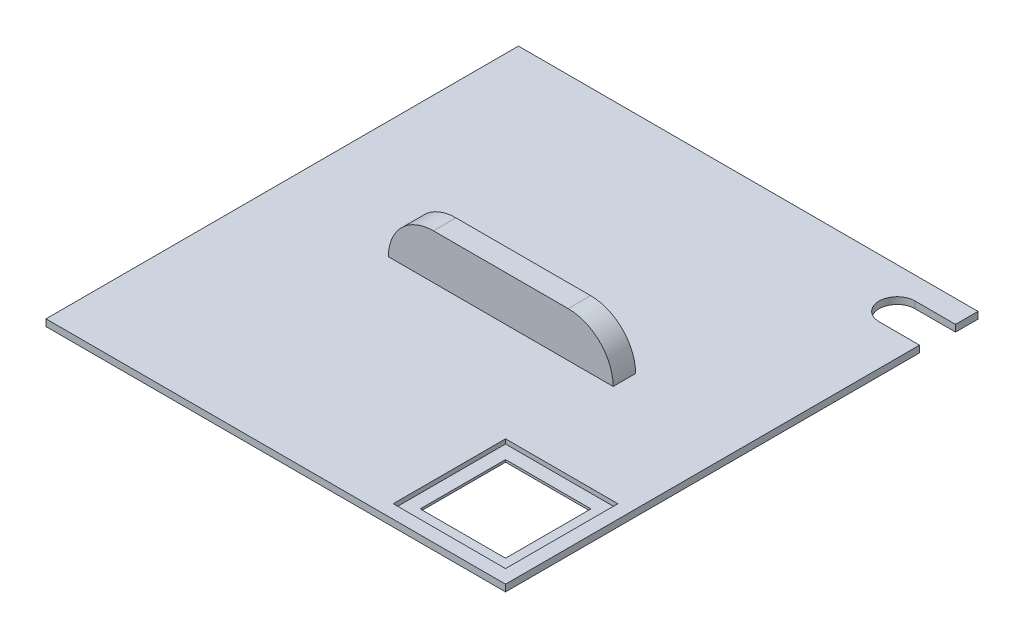
ISO-10303-21;
HEADER;
FILE_DESCRIPTION(('STEP AP214'),'2;1');
FILE_NAME('part.step','',(''),(''),'','','');
FILE_SCHEMA(('AUTOMOTIVE_DESIGN { 1 0 10303 214 1 1 1 1 }'));
ENDSEC;
DATA;
#1=APPLICATION_CONTEXT('core data for automotive mechanical design processes');
#2=APPLICATION_PROTOCOL_DEFINITION('international standard','automotive_design',2000,#1);
#3=PRODUCT_CONTEXT('',#1,'mechanical');
#4=PRODUCT('Part','Part','',(#3));
#5=PRODUCT_RELATED_PRODUCT_CATEGORY('part','',(#4));
#6=PRODUCT_DEFINITION_FORMATION('','',#4);
#7=PRODUCT_DEFINITION_CONTEXT('part definition',#1,'design');
#8=PRODUCT_DEFINITION('design','',#6,#7);
#9=PRODUCT_DEFINITION_SHAPE('','',#8);
#10=(LENGTH_UNIT() NAMED_UNIT(*) SI_UNIT(.MILLI.,.METRE.));
#11=(NAMED_UNIT(*) PLANE_ANGLE_UNIT() SI_UNIT($,.RADIAN.));
#12=(NAMED_UNIT(*) SI_UNIT($,.STERADIAN.) SOLID_ANGLE_UNIT());
#13=UNCERTAINTY_MEASURE_WITH_UNIT(LENGTH_MEASURE(1.E-05),#10,'distance_accuracy_value','');
#14=(GEOMETRIC_REPRESENTATION_CONTEXT(3) GLOBAL_UNCERTAINTY_ASSIGNED_CONTEXT((#13)) GLOBAL_UNIT_ASSIGNED_CONTEXT((#10,
#11,#12)) REPRESENTATION_CONTEXT('',''));
#15=CARTESIAN_POINT('',(0.,0.,0.));
#16=DIRECTION('',(0.,0.,1.));
#17=DIRECTION('',(1.,0.,0.));
#18=AXIS2_PLACEMENT_3D('',#15,#16,#17);
#19=CARTESIAN_POINT('',(0.,0.5,0.));
#20=DIRECTION('',(0.,1.,0.));
#21=DIRECTION('',(0.,0.,1.));
#22=AXIS2_PLACEMENT_3D('',#19,#20,#21);
#23=PLANE('',#22);
#24=DIRECTION('',(0.,0.,-1.));
#25=VECTOR('',#24,1.);
#26=CARTESIAN_POINT('',(23.125,0.5,0.));
#27=LINE('',#26,#25);
#28=CARTESIAN_POINT('',(23.125,0.5,49.5607958073796));
#29=VERTEX_POINT('',#28);
#30=CARTESIAN_POINT('',(23.125,0.5,24.5607958073796));
#31=VERTEX_POINT('',#30);
#32=EDGE_CURVE('E207',#29,#31,#27,.T.);
#33=ORIENTED_EDGE('',*,*,#32,.F.);
#34=DIRECTION('',(-1.,0.,0.));
#35=VECTOR('',#34,1.);
#36=CARTESIAN_POINT('',(0.,0.5,49.5607958073796));
#37=LINE('',#36,#35);
#38=CARTESIAN_POINT('',(48.125,0.5,49.5607958073796));
#39=VERTEX_POINT('',#38);
#40=EDGE_CURVE('E209',#39,#29,#37,.T.);
#41=ORIENTED_EDGE('',*,*,#40,.F.);
#42=DIRECTION('',(0.,0.,-1.));
#43=VECTOR('',#42,1.);
#44=CARTESIAN_POINT('',(48.125,0.5,0.));
#45=LINE('',#44,#43);
#46=CARTESIAN_POINT('',(48.125,0.5,24.5607958073796));
#47=VERTEX_POINT('',#46);
#48=EDGE_CURVE('E212',#39,#47,#45,.T.);
#49=ORIENTED_EDGE('',*,*,#48,.T.);
#50=DIRECTION('',(-1.,0.,0.));
#51=VECTOR('',#50,1.);
#52=CARTESIAN_POINT('',(0.,0.5,24.5607958073796));
#53=LINE('',#52,#51);
#54=EDGE_CURVE('E215',#47,#31,#53,.T.);
#55=ORIENTED_EDGE('',*,*,#54,.T.);
#56=EDGE_LOOP('',(#33,#41,#49,#55));
#57=FACE_BOUND('',#56,.T.);
#58=DIRECTION('',(1.,0.,0.));
#59=VECTOR('',#58,1.);
#60=CARTESIAN_POINT('',(0.,0.5,27.5607958073796));
#61=LINE('',#60,#59);
#62=CARTESIAN_POINT('',(26.125,0.5,27.5607958073796));
#63=VERTEX_POINT('',#62);
#64=CARTESIAN_POINT('',(45.125,0.5,27.5607958073796));
#65=VERTEX_POINT('',#64);
#66=EDGE_CURVE('E182',#63,#65,#61,.T.);
#67=ORIENTED_EDGE('',*,*,#66,.T.);
#68=DIRECTION('',(0.,0.,1.));
#69=VECTOR('',#68,1.);
#70=CARTESIAN_POINT('',(45.125,0.5,0.));
#71=LINE('',#70,#69);
#72=CARTESIAN_POINT('',(45.125,0.5,46.5607958073796));
#73=VERTEX_POINT('',#72);
#74=EDGE_CURVE('E190',#65,#73,#71,.T.);
#75=ORIENTED_EDGE('',*,*,#74,.T.);
#76=DIRECTION('',(1.,0.,0.));
#77=VECTOR('',#76,1.);
#78=CARTESIAN_POINT('',(0.,0.5,46.5607958073796));
#79=LINE('',#78,#77);
#80=CARTESIAN_POINT('',(26.125,0.5,46.5607958073796));
#81=VERTEX_POINT('',#80);
#82=EDGE_CURVE('E187',#81,#73,#79,.T.);
#83=ORIENTED_EDGE('',*,*,#82,.F.);
#84=DIRECTION('',(0.,0.,1.));
#85=VECTOR('',#84,1.);
#86=CARTESIAN_POINT('',(26.125,0.5,0.));
#87=LINE('',#86,#85);
#88=EDGE_CURVE('E58',#63,#81,#87,.T.);
#89=ORIENTED_EDGE('',*,*,#88,.F.);
#90=EDGE_LOOP('',(#67,#75,#83,#89));
#91=FACE_BOUND('',#90,.T.);
#92=ADVANCED_FACE('F43',(#57,#91),#23,.T.);
#93=CARTESIAN_POINT('',(0.,0.,0.));
#94=DIRECTION('',(0.,1.,0.));
#95=DIRECTION('',(0.,0.,1.));
#96=AXIS2_PLACEMENT_3D('',#93,#94,#95);
#97=PLANE('',#96);
#98=CARTESIAN_POINT('',(42.125,0.,-43.5607958073796));
#99=DIRECTION('',(0.,1.,0.));
#100=DIRECTION('',(0.,0.,1.));
#101=AXIS2_PLACEMENT_3D('',#98,#99,#100);
#102=CIRCLE('',#101,4.);
#103=CARTESIAN_POINT('',(42.125,0.,-47.5607958073796));
#104=VERTEX_POINT('',#103);
#105=CARTESIAN_POINT('',(42.125,0.,-39.5607958073796));
#106=VERTEX_POINT('',#105);
#107=EDGE_CURVE('E267',#104,#106,#102,.T.);
#108=ORIENTED_EDGE('',*,*,#107,.T.);
#109=DIRECTION('',(1.,0.,0.));
#110=VECTOR('',#109,1.);
#111=CARTESIAN_POINT('',(0.,0.,-39.5607958073796));
#112=LINE('',#111,#110);
#113=CARTESIAN_POINT('',(51.125,0.,-39.5607958073796));
#114=VERTEX_POINT('',#113);
#115=EDGE_CURVE('E274',#106,#114,#112,.T.);
#116=ORIENTED_EDGE('',*,*,#115,.T.);
#117=DIRECTION('',(0.,0.,1.));
#118=VECTOR('',#117,1.);
#119=CARTESIAN_POINT('',(51.125,0.,0.));
#120=LINE('',#119,#118);
#121=CARTESIAN_POINT('',(51.125,0.,52.5607958073796));
#122=VERTEX_POINT('',#121);
#123=EDGE_CURVE('E300',#114,#122,#120,.T.);
#124=ORIENTED_EDGE('',*,*,#123,.T.);
#125=DIRECTION('',(1.,0.,0.));
#126=VECTOR('',#125,1.);
#127=CARTESIAN_POINT('',(0.,0.,52.5607958073796));
#128=LINE('',#127,#126);
#129=CARTESIAN_POINT('',(-51.125,0.,52.5607958073796));
#130=VERTEX_POINT('',#129);
#131=EDGE_CURVE('E305',#130,#122,#128,.T.);
#132=ORIENTED_EDGE('',*,*,#131,.F.);
#133=DIRECTION('',(0.,0.,1.));
#134=VECTOR('',#133,1.);
#135=CARTESIAN_POINT('',(-51.125,0.,0.));
#136=LINE('',#135,#134);
#137=CARTESIAN_POINT('',(-51.125,0.,-52.5607958073796));
#138=VERTEX_POINT('',#137);
#139=EDGE_CURVE('E303',#138,#130,#136,.T.);
#140=ORIENTED_EDGE('',*,*,#139,.F.);
#141=DIRECTION('',(1.,0.,0.));
#142=VECTOR('',#141,1.);
#143=CARTESIAN_POINT('',(0.,0.,-52.5607958073796));
#144=LINE('',#143,#142);
#145=CARTESIAN_POINT('',(51.125,0.,-52.5607958073796));
#146=VERTEX_POINT('',#145);
#147=EDGE_CURVE('E299',#138,#146,#144,.T.);
#148=ORIENTED_EDGE('',*,*,#147,.T.);
#149=CARTESIAN_POINT('',(51.125,0.,-47.5607958073796));
#150=VERTEX_POINT('',#149);
#151=EDGE_CURVE('E296',#146,#150,#120,.T.);
#152=ORIENTED_EDGE('',*,*,#151,.T.);
#153=DIRECTION('',(1.,0.,0.));
#154=VECTOR('',#153,1.);
#155=CARTESIAN_POINT('',(0.,0.,-47.5607958073796));
#156=LINE('',#155,#154);
#157=EDGE_CURVE('E293',#104,#150,#156,.T.);
#158=ORIENTED_EDGE('',*,*,#157,.F.);
#159=EDGE_LOOP('',(#108,#116,#124,#132,#140,#148,#152,#158));
#160=FACE_BOUND('',#159,.T.);
#161=DIRECTION('',(0.,0.,1.));
#162=VECTOR('',#161,1.);
#163=CARTESIAN_POINT('',(45.125,0.,0.));
#164=LINE('',#163,#162);
#165=CARTESIAN_POINT('',(45.125,0.,27.5607958073796));
#166=VERTEX_POINT('',#165);
#167=CARTESIAN_POINT('',(45.125,0.,46.5607958073796));
#168=VERTEX_POINT('',#167);
#169=EDGE_CURVE('E11',#166,#168,#164,.T.);
#170=ORIENTED_EDGE('',*,*,#169,.F.);
#171=DIRECTION('',(1.,0.,0.));
#172=VECTOR('',#171,1.);
#173=CARTESIAN_POINT('',(0.,0.,27.5607958073796));
#174=LINE('',#173,#172);
#175=CARTESIAN_POINT('',(26.125,0.,27.5607958073796));
#176=VERTEX_POINT('',#175);
#177=EDGE_CURVE('E184',#176,#166,#174,.T.);
#178=ORIENTED_EDGE('',*,*,#177,.F.);
#179=DIRECTION('',(0.,0.,1.));
#180=VECTOR('',#179,1.);
#181=CARTESIAN_POINT('',(26.125,0.,0.));
#182=LINE('',#181,#180);
#183=CARTESIAN_POINT('',(26.125,0.,46.5607958073796));
#184=VERTEX_POINT('',#183);
#185=EDGE_CURVE('E327',#176,#184,#182,.T.);
#186=ORIENTED_EDGE('',*,*,#185,.T.);
#187=DIRECTION('',(1.,0.,0.));
#188=VECTOR('',#187,1.);
#189=CARTESIAN_POINT('',(0.,0.,46.5607958073796));
#190=LINE('',#189,#188);
#191=EDGE_CURVE('E51',#184,#168,#190,.T.);
#192=ORIENTED_EDGE('',*,*,#191,.T.);
#193=EDGE_LOOP('',(#170,#178,#186,#192));
#194=FACE_BOUND('',#193,.T.);
#195=ADVANCED_FACE('F331',(#160,#194),#97,.F.);
#196=CARTESIAN_POINT('',(0.,1.5,0.));
#197=DIRECTION('',(0.,1.,0.));
#198=DIRECTION('',(0.,0.,1.));
#199=AXIS2_PLACEMENT_3D('',#196,#197,#198);
#200=PLANE('',#199);
#201=DIRECTION('',(0.,0.,-1.));
#202=VECTOR('',#201,1.);
#203=CARTESIAN_POINT('',(25.,1.49999999999993,2.5));
#204=LINE('',#203,#202);
#205=CARTESIAN_POINT('',(25.,1.49999999999993,2.5));
#206=VERTEX_POINT('',#205);
#207=CARTESIAN_POINT('',(25.,1.49999999999993,-2.5));
#208=VERTEX_POINT('',#207);
#209=EDGE_CURVE('E231',#206,#208,#204,.T.);
#210=ORIENTED_EDGE('',*,*,#209,.F.);
#211=DIRECTION('',(1.,0.,0.));
#212=VECTOR('',#211,1.);
#213=CARTESIAN_POINT('',(-15.,1.5,2.5));
#214=LINE('',#213,#212);
#215=CARTESIAN_POINT('',(-25.,1.49999999999993,2.5));
#216=VERTEX_POINT('',#215);
#217=EDGE_CURVE('E253',#216,#206,#214,.T.);
#218=ORIENTED_EDGE('',*,*,#217,.F.);
#219=DIRECTION('',(0.,0.,-1.));
#220=VECTOR('',#219,1.);
#221=CARTESIAN_POINT('',(-25.,1.49999999999993,2.5));
#222=LINE('',#221,#220);
#223=CARTESIAN_POINT('',(-25.,1.49999999999993,-2.5));
#224=VERTEX_POINT('',#223);
#225=EDGE_CURVE('E245',#216,#224,#222,.T.);
#226=ORIENTED_EDGE('',*,*,#225,.T.);
#227=DIRECTION('',(-1.,0.,0.));
#228=VECTOR('',#227,1.);
#229=CARTESIAN_POINT('',(-15.,1.5,-2.5));
#230=LINE('',#229,#228);
#231=EDGE_CURVE('E258',#208,#224,#230,.T.);
#232=ORIENTED_EDGE('',*,*,#231,.F.);
#233=EDGE_LOOP('',(#210,#218,#226,#232));
#234=FACE_BOUND('',#233,.T.);
#235=CARTESIAN_POINT('',(42.125,1.5,-43.5607958073796));
#236=DIRECTION('',(0.,1.,0.));
#237=DIRECTION('',(0.,0.,1.));
#238=AXIS2_PLACEMENT_3D('',#235,#236,#237);
#239=CIRCLE('',#238,4.);
#240=CARTESIAN_POINT('',(42.125,1.5,-47.5607958073796));
#241=VERTEX_POINT('',#240);
#242=CARTESIAN_POINT('',(42.125,1.5,-39.5607958073796));
#243=VERTEX_POINT('',#242);
#244=EDGE_CURVE('E270',#241,#243,#239,.T.);
#245=ORIENTED_EDGE('',*,*,#244,.F.);
#246=DIRECTION('',(1.,0.,0.));
#247=VECTOR('',#246,1.);
#248=CARTESIAN_POINT('',(0.,1.5,-47.5607958073796));
#249=LINE('',#248,#247);
#250=CARTESIAN_POINT('',(51.125,1.5,-47.5607958073796));
#251=VERTEX_POINT('',#250);
#252=EDGE_CURVE('E273',#241,#251,#249,.T.);
#253=ORIENTED_EDGE('',*,*,#252,.T.);
#254=DIRECTION('',(0.,0.,1.));
#255=VECTOR('',#254,1.);
#256=CARTESIAN_POINT('',(51.125,1.5,0.));
#257=LINE('',#256,#255);
#258=CARTESIAN_POINT('',(51.125,1.5,-52.5607958073796));
#259=VERTEX_POINT('',#258);
#260=EDGE_CURVE('E276',#259,#251,#257,.T.);
#261=ORIENTED_EDGE('',*,*,#260,.F.);
#262=DIRECTION('',(1.,0.,0.));
#263=VECTOR('',#262,1.);
#264=CARTESIAN_POINT('',(0.,1.5,-52.5607958073796));
#265=LINE('',#264,#263);
#266=CARTESIAN_POINT('',(-51.125,1.5,-52.5607958073796));
#267=VERTEX_POINT('',#266);
#268=EDGE_CURVE('E279',#267,#259,#265,.T.);
#269=ORIENTED_EDGE('',*,*,#268,.F.);
#270=DIRECTION('',(0.,0.,1.));
#271=VECTOR('',#270,1.);
#272=CARTESIAN_POINT('',(-51.125,1.5,0.));
#273=LINE('',#272,#271);
#274=CARTESIAN_POINT('',(-51.125,1.5,52.5607958073796));
#275=VERTEX_POINT('',#274);
#276=EDGE_CURVE('E283',#267,#275,#273,.T.);
#277=ORIENTED_EDGE('',*,*,#276,.T.);
#278=DIRECTION('',(1.,0.,0.));
#279=VECTOR('',#278,1.);
#280=CARTESIAN_POINT('',(0.,1.5,52.5607958073796));
#281=LINE('',#280,#279);
#282=CARTESIAN_POINT('',(51.125,1.5,52.5607958073796));
#283=VERTEX_POINT('',#282);
#284=EDGE_CURVE('E285',#275,#283,#281,.T.);
#285=ORIENTED_EDGE('',*,*,#284,.T.);
#286=CARTESIAN_POINT('',(51.125,1.5,-39.5607958073796));
#287=VERTEX_POINT('',#286);
#288=EDGE_CURVE('E280',#287,#283,#257,.T.);
#289=ORIENTED_EDGE('',*,*,#288,.F.);
#290=DIRECTION('',(1.,0.,0.));
#291=VECTOR('',#290,1.);
#292=CARTESIAN_POINT('',(0.,1.5,-39.5607958073796));
#293=LINE('',#292,#291);
#294=EDGE_CURVE('E287',#243,#287,#293,.T.);
#295=ORIENTED_EDGE('',*,*,#294,.F.);
#296=EDGE_LOOP('',(#245,#253,#261,#269,#277,#285,#289,#295));
#297=FACE_BOUND('',#296,.T.);
#298=DIRECTION('',(-1.,0.,0.));
#299=VECTOR('',#298,1.);
#300=CARTESIAN_POINT('',(0.,1.5,49.5607958073796));
#301=LINE('',#300,#299);
#302=CARTESIAN_POINT('',(48.125,1.5,49.5607958073796));
#303=VERTEX_POINT('',#302);
#304=CARTESIAN_POINT('',(23.125,1.5,49.5607958073796));
#305=VERTEX_POINT('',#304);
#306=EDGE_CURVE('E221',#303,#305,#301,.T.);
#307=ORIENTED_EDGE('',*,*,#306,.T.);
#308=DIRECTION('',(0.,0.,-1.));
#309=VECTOR('',#308,1.);
#310=CARTESIAN_POINT('',(23.125,1.5,0.));
#311=LINE('',#310,#309);
#312=CARTESIAN_POINT('',(23.125,1.5,24.5607958073796));
#313=VERTEX_POINT('',#312);
#314=EDGE_CURVE('E203',#305,#313,#311,.T.);
#315=ORIENTED_EDGE('',*,*,#314,.T.);
#316=DIRECTION('',(-1.,0.,0.));
#317=VECTOR('',#316,1.);
#318=CARTESIAN_POINT('',(0.,1.5,24.5607958073796));
#319=LINE('',#318,#317);
#320=CARTESIAN_POINT('',(48.125,1.5,24.5607958073796));
#321=VERTEX_POINT('',#320);
#322=EDGE_CURVE('E210',#321,#313,#319,.T.);
#323=ORIENTED_EDGE('',*,*,#322,.F.);
#324=DIRECTION('',(0.,0.,-1.));
#325=VECTOR('',#324,1.);
#326=CARTESIAN_POINT('',(48.125,1.5,0.));
#327=LINE('',#326,#325);
#328=EDGE_CURVE('E224',#303,#321,#327,.T.);
#329=ORIENTED_EDGE('',*,*,#328,.F.);
#330=EDGE_LOOP('',(#307,#315,#323,#329));
#331=FACE_BOUND('',#330,.T.);
#332=ADVANCED_FACE('F350',(#234,#297,#331),#200,.T.);
#333=CARTESIAN_POINT('',(42.125,1.5,-43.5607958073796));
#334=DIRECTION('',(0.,-1.,0.));
#335=DIRECTION('',(0.,0.,-1.));
#336=AXIS2_PLACEMENT_3D('',#333,#334,#335);
#337=CYLINDRICAL_SURFACE('',#336,4.);
#338=ORIENTED_EDGE('',*,*,#107,.F.);
#339=DIRECTION('',(0.,-1.,0.));
#340=VECTOR('',#339,1.);
#341=CARTESIAN_POINT('',(42.125,1.5,-47.5607958073796));
#342=LINE('',#341,#340);
#343=EDGE_CURVE('E324',#241,#104,#342,.T.);
#344=ORIENTED_EDGE('',*,*,#343,.F.);
#345=ORIENTED_EDGE('',*,*,#244,.T.);
#346=DIRECTION('',(0.,-1.,0.));
#347=VECTOR('',#346,1.);
#348=CARTESIAN_POINT('',(42.125,1.5,-39.5607958073796));
#349=LINE('',#348,#347);
#350=EDGE_CURVE('E290',#243,#106,#349,.T.);
#351=ORIENTED_EDGE('',*,*,#350,.T.);
#352=EDGE_LOOP('',(#338,#344,#345,#351));
#353=FACE_BOUND('',#352,.T.);
#354=ADVANCED_FACE('F45',(#353),#337,.F.);
#355=CARTESIAN_POINT('',(0.,1.5,-47.5607958073796));
#356=DIRECTION('',(0.,0.,-1.));
#357=DIRECTION('',(-1.,0.,0.));
#358=AXIS2_PLACEMENT_3D('',#355,#356,#357);
#359=PLANE('',#358);
#360=ORIENTED_EDGE('',*,*,#157,.T.);
#361=DIRECTION('',(0.,-1.,0.));
#362=VECTOR('',#361,1.);
#363=CARTESIAN_POINT('',(51.125,1.5,-47.5607958073796));
#364=LINE('',#363,#362);
#365=EDGE_CURVE('E322',#251,#150,#364,.T.);
#366=ORIENTED_EDGE('',*,*,#365,.F.);
#367=ORIENTED_EDGE('',*,*,#252,.F.);
#368=ORIENTED_EDGE('',*,*,#343,.T.);
#369=EDGE_LOOP('',(#360,#366,#367,#368));
#370=FACE_BOUND('',#369,.T.);
#371=ADVANCED_FACE('F414',(#370),#359,.F.);
#372=CARTESIAN_POINT('',(51.125,1.5,0.));
#373=DIRECTION('',(1.,0.,0.));
#374=DIRECTION('',(0.,0.,-1.));
#375=AXIS2_PLACEMENT_3D('',#372,#373,#374);
#376=PLANE('',#375);
#377=ORIENTED_EDGE('',*,*,#151,.F.);
#378=DIRECTION('',(0.,-1.,0.));
#379=VECTOR('',#378,1.);
#380=CARTESIAN_POINT('',(51.125,1.5,-52.5607958073796));
#381=LINE('',#380,#379);
#382=EDGE_CURVE('E320',#259,#146,#381,.T.);
#383=ORIENTED_EDGE('',*,*,#382,.F.);
#384=ORIENTED_EDGE('',*,*,#260,.T.);
#385=ORIENTED_EDGE('',*,*,#365,.T.);
#386=EDGE_LOOP('',(#377,#383,#384,#385));
#387=FACE_BOUND('',#386,.T.);
#388=ADVANCED_FACE('F403',(#387),#376,.T.);
#389=CARTESIAN_POINT('',(0.,1.5,-52.5607958073796));
#390=DIRECTION('',(0.,0.,-1.));
#391=DIRECTION('',(-1.,0.,0.));
#392=AXIS2_PLACEMENT_3D('',#389,#390,#391);
#393=PLANE('',#392);
#394=ORIENTED_EDGE('',*,*,#147,.F.);
#395=DIRECTION('',(0.,-1.,0.));
#396=VECTOR('',#395,1.);
#397=CARTESIAN_POINT('',(-51.125,1.5,-52.5607958073796));
#398=LINE('',#397,#396);
#399=EDGE_CURVE('E318',#267,#138,#398,.T.);
#400=ORIENTED_EDGE('',*,*,#399,.F.);
#401=ORIENTED_EDGE('',*,*,#268,.T.);
#402=ORIENTED_EDGE('',*,*,#382,.T.);
#403=EDGE_LOOP('',(#394,#400,#401,#402));
#404=FACE_BOUND('',#403,.T.);
#405=ADVANCED_FACE('F410',(#404),#393,.T.);
#406=CARTESIAN_POINT('',(-51.125,1.5,0.));
#407=DIRECTION('',(1.,0.,0.));
#408=DIRECTION('',(0.,0.,-1.));
#409=AXIS2_PLACEMENT_3D('',#406,#407,#408);
#410=PLANE('',#409);
#411=ORIENTED_EDGE('',*,*,#139,.T.);
#412=DIRECTION('',(0.,-1.,0.));
#413=VECTOR('',#412,1.);
#414=CARTESIAN_POINT('',(-51.125,1.5,52.5607958073796));
#415=LINE('',#414,#413);
#416=EDGE_CURVE('E315',#275,#130,#415,.T.);
#417=ORIENTED_EDGE('',*,*,#416,.F.);
#418=ORIENTED_EDGE('',*,*,#276,.F.);
#419=ORIENTED_EDGE('',*,*,#399,.T.);
#420=EDGE_LOOP('',(#411,#417,#418,#419));
#421=FACE_BOUND('',#420,.T.);
#422=ADVANCED_FACE('F406',(#421),#410,.F.);
#423=CARTESIAN_POINT('',(0.,1.5,52.5607958073796));
#424=DIRECTION('',(0.,0.,-1.));
#425=DIRECTION('',(-1.,0.,0.));
#426=AXIS2_PLACEMENT_3D('',#423,#424,#425);
#427=PLANE('',#426);
#428=ORIENTED_EDGE('',*,*,#131,.T.);
#429=DIRECTION('',(0.,-1.,0.));
#430=VECTOR('',#429,1.);
#431=CARTESIAN_POINT('',(51.125,1.5,52.5607958073796));
#432=LINE('',#431,#430);
#433=EDGE_CURVE('E313',#283,#122,#432,.T.);
#434=ORIENTED_EDGE('',*,*,#433,.F.);
#435=ORIENTED_EDGE('',*,*,#284,.F.);
#436=ORIENTED_EDGE('',*,*,#416,.T.);
#437=EDGE_LOOP('',(#428,#434,#435,#436));
#438=FACE_BOUND('',#437,.T.);
#439=ADVANCED_FACE('F401',(#438),#427,.F.);
#440=ORIENTED_EDGE('',*,*,#123,.F.);
#441=DIRECTION('',(0.,-1.,0.));
#442=VECTOR('',#441,1.);
#443=CARTESIAN_POINT('',(51.125,1.5,-39.5607958073796));
#444=LINE('',#443,#442);
#445=EDGE_CURVE('E311',#287,#114,#444,.T.);
#446=ORIENTED_EDGE('',*,*,#445,.F.);
#447=ORIENTED_EDGE('',*,*,#288,.T.);
#448=ORIENTED_EDGE('',*,*,#433,.T.);
#449=EDGE_LOOP('',(#440,#446,#447,#448));
#450=FACE_BOUND('',#449,.T.);
#451=ADVANCED_FACE('F397',(#450),#376,.T.);
#452=CARTESIAN_POINT('',(0.,1.5,-39.5607958073796));
#453=DIRECTION('',(0.,0.,-1.));
#454=DIRECTION('',(-1.,0.,0.));
#455=AXIS2_PLACEMENT_3D('',#452,#453,#454);
#456=PLANE('',#455);
#457=ORIENTED_EDGE('',*,*,#115,.F.);
#458=ORIENTED_EDGE('',*,*,#350,.F.);
#459=ORIENTED_EDGE('',*,*,#294,.T.);
#460=ORIENTED_EDGE('',*,*,#445,.T.);
#461=EDGE_LOOP('',(#457,#458,#459,#460));
#462=FACE_BOUND('',#461,.T.);
#463=ADVANCED_FACE('F390',(#462),#456,.T.);
#464=CARTESIAN_POINT('',(-15.,11.5,2.5));
#465=DIRECTION('',(0.,0.,-1.));
#466=DIRECTION('',(-1.,0.,0.));
#467=AXIS2_PLACEMENT_3D('',#464,#465,#466);
#468=PLANE('',#467);
#469=ORIENTED_EDGE('',*,*,#217,.T.);
#470=CARTESIAN_POINT('',(15.,1.5,2.5));
#471=DIRECTION('',(0.,0.,1.));
#472=DIRECTION('',(1.,0.,0.));
#473=AXIS2_PLACEMENT_3D('',#470,#471,#472);
#474=CIRCLE('',#473,10.);
#475=CARTESIAN_POINT('',(15.,11.5,2.5));
#476=VERTEX_POINT('',#475);
#477=EDGE_CURVE('E242',#206,#476,#474,.T.);
#478=ORIENTED_EDGE('',*,*,#477,.T.);
#479=DIRECTION('',(1.,0.,0.));
#480=VECTOR('',#479,1.);
#481=CARTESIAN_POINT('',(-15.,11.5,2.5));
#482=LINE('',#481,#480);
#483=CARTESIAN_POINT('',(-15.,11.5,2.5));
#484=VERTEX_POINT('',#483);
#485=EDGE_CURVE('E257',#484,#476,#482,.T.);
#486=ORIENTED_EDGE('',*,*,#485,.F.);
#487=CARTESIAN_POINT('',(-15.,1.5,2.5));
#488=DIRECTION('',(0.,0.,-1.));
#489=DIRECTION('',(-1.,0.,0.));
#490=AXIS2_PLACEMENT_3D('',#487,#488,#489);
#491=CIRCLE('',#490,10.);
#492=EDGE_CURVE('E251',#216,#484,#491,.T.);
#493=ORIENTED_EDGE('',*,*,#492,.F.);
#494=EDGE_LOOP('',(#469,#478,#486,#493));
#495=FACE_BOUND('',#494,.T.);
#496=ADVANCED_FACE('F386',(#495),#468,.F.);
#497=CARTESIAN_POINT('',(-15.,11.5,-2.5));
#498=DIRECTION('',(0.,0.,1.));
#499=DIRECTION('',(1.,0.,0.));
#500=AXIS2_PLACEMENT_3D('',#497,#498,#499);
#501=PLANE('',#500);
#502=ORIENTED_EDGE('',*,*,#231,.T.);
#503=CARTESIAN_POINT('',(-15.,1.5,-2.5));
#504=DIRECTION('',(0.,0.,-1.));
#505=DIRECTION('',(-1.,0.,0.));
#506=AXIS2_PLACEMENT_3D('',#503,#504,#505);
#507=CIRCLE('',#506,10.);
#508=CARTESIAN_POINT('',(-15.,11.5,-2.5));
#509=VERTEX_POINT('',#508);
#510=EDGE_CURVE('E248',#224,#509,#507,.T.);
#511=ORIENTED_EDGE('',*,*,#510,.T.);
#512=DIRECTION('',(-1.,0.,0.));
#513=VECTOR('',#512,1.);
#514=CARTESIAN_POINT('',(-15.,11.5,-2.5));
#515=LINE('',#514,#513);
#516=CARTESIAN_POINT('',(15.,11.5,-2.5));
#517=VERTEX_POINT('',#516);
#518=EDGE_CURVE('E264',#517,#509,#515,.T.);
#519=ORIENTED_EDGE('',*,*,#518,.F.);
#520=CARTESIAN_POINT('',(15.,1.5,-2.5));
#521=DIRECTION('',(0.,0.,1.));
#522=DIRECTION('',(1.,0.,0.));
#523=AXIS2_PLACEMENT_3D('',#520,#521,#522);
#524=CIRCLE('',#523,10.);
#525=EDGE_CURVE('E240',#208,#517,#524,.T.);
#526=ORIENTED_EDGE('',*,*,#525,.F.);
#527=EDGE_LOOP('',(#502,#511,#519,#526));
#528=FACE_BOUND('',#527,.T.);
#529=ADVANCED_FACE('F382',(#528),#501,.F.);
#530=CARTESIAN_POINT('',(0.,11.5,0.));
#531=DIRECTION('',(0.,1.,0.));
#532=DIRECTION('',(0.,0.,1.));
#533=AXIS2_PLACEMENT_3D('',#530,#531,#532);
#534=PLANE('',#533);
#535=DIRECTION('',(0.,0.,1.));
#536=VECTOR('',#535,1.);
#537=CARTESIAN_POINT('',(-15.,11.5,-2.5));
#538=LINE('',#537,#536);
#539=EDGE_CURVE('E254',#509,#484,#538,.T.);
#540=ORIENTED_EDGE('',*,*,#539,.T.);
#541=ORIENTED_EDGE('',*,*,#485,.T.);
#542=DIRECTION('',(0.,0.,-1.));
#543=VECTOR('',#542,1.);
#544=CARTESIAN_POINT('',(15.,11.5,-2.5));
#545=LINE('',#544,#543);
#546=EDGE_CURVE('E261',#476,#517,#545,.T.);
#547=ORIENTED_EDGE('',*,*,#546,.T.);
#548=ORIENTED_EDGE('',*,*,#518,.T.);
#549=EDGE_LOOP('',(#540,#541,#547,#548));
#550=FACE_BOUND('',#549,.T.);
#551=ADVANCED_FACE('F378',(#550),#534,.T.);
#552=CARTESIAN_POINT('',(-15.,1.5,2.5));
#553=DIRECTION('',(0.,0.,-1.));
#554=DIRECTION('',(-1.,0.,0.));
#555=AXIS2_PLACEMENT_3D('',#552,#553,#554);
#556=CYLINDRICAL_SURFACE('',#555,10.);
#557=ORIENTED_EDGE('',*,*,#539,.F.);
#558=ORIENTED_EDGE('',*,*,#510,.F.);
#559=ORIENTED_EDGE('',*,*,#225,.F.);
#560=ORIENTED_EDGE('',*,*,#492,.T.);
#561=EDGE_LOOP('',(#557,#558,#559,#560));
#562=FACE_BOUND('',#561,.T.);
#563=ADVANCED_FACE('F374',(#562),#556,.T.);
#564=CARTESIAN_POINT('',(15.,1.5,2.5));
#565=DIRECTION('',(0.,0.,-1.));
#566=DIRECTION('',(1.,0.,0.));
#567=AXIS2_PLACEMENT_3D('',#564,#565,#566);
#568=CYLINDRICAL_SURFACE('',#567,10.);
#569=ORIENTED_EDGE('',*,*,#525,.T.);
#570=ORIENTED_EDGE('',*,*,#546,.F.);
#571=ORIENTED_EDGE('',*,*,#477,.F.);
#572=ORIENTED_EDGE('',*,*,#209,.T.);
#573=EDGE_LOOP('',(#569,#570,#571,#572));
#574=FACE_BOUND('',#573,.T.);
#575=ADVANCED_FACE('F370',(#574),#568,.T.);
#576=CARTESIAN_POINT('',(23.125,0.5,0.));
#577=DIRECTION('',(1.,0.,0.));
#578=DIRECTION('',(0.,0.,-1.));
#579=AXIS2_PLACEMENT_3D('',#576,#577,#578);
#580=PLANE('',#579);
#581=ORIENTED_EDGE('',*,*,#314,.F.);
#582=DIRECTION('',(0.,1.,0.));
#583=VECTOR('',#582,1.);
#584=CARTESIAN_POINT('',(23.125,0.5,49.5607958073796));
#585=LINE('',#584,#583);
#586=EDGE_CURVE('E218',#29,#305,#585,.T.);
#587=ORIENTED_EDGE('',*,*,#586,.F.);
#588=ORIENTED_EDGE('',*,*,#32,.T.);
#589=DIRECTION('',(0.,1.,0.));
#590=VECTOR('',#589,1.);
#591=CARTESIAN_POINT('',(23.125,0.5,24.5607958073796));
#592=LINE('',#591,#590);
#593=EDGE_CURVE('E229',#31,#313,#592,.T.);
#594=ORIENTED_EDGE('',*,*,#593,.T.);
#595=EDGE_LOOP('',(#581,#587,#588,#594));
#596=FACE_BOUND('',#595,.T.);
#597=ADVANCED_FACE('F360',(#596),#580,.T.);
#598=CARTESIAN_POINT('',(0.,0.5,24.5607958073796));
#599=DIRECTION('',(0.,0.,-1.));
#600=DIRECTION('',(-1.,0.,0.));
#601=AXIS2_PLACEMENT_3D('',#598,#599,#600);
#602=PLANE('',#601);
#603=ORIENTED_EDGE('',*,*,#322,.T.);
#604=ORIENTED_EDGE('',*,*,#593,.F.);
#605=ORIENTED_EDGE('',*,*,#54,.F.);
#606=DIRECTION('',(0.,1.,0.));
#607=VECTOR('',#606,1.);
#608=CARTESIAN_POINT('',(48.125,0.5,24.5607958073796));
#609=LINE('',#608,#607);
#610=EDGE_CURVE('E232',#47,#321,#609,.T.);
#611=ORIENTED_EDGE('',*,*,#610,.T.);
#612=EDGE_LOOP('',(#603,#604,#605,#611));
#613=FACE_BOUND('',#612,.T.);
#614=ADVANCED_FACE('F356',(#613),#602,.F.);
#615=CARTESIAN_POINT('',(48.125,0.5,0.));
#616=DIRECTION('',(1.,0.,0.));
#617=DIRECTION('',(0.,0.,-1.));
#618=AXIS2_PLACEMENT_3D('',#615,#616,#617);
#619=PLANE('',#618);
#620=ORIENTED_EDGE('',*,*,#328,.T.);
#621=ORIENTED_EDGE('',*,*,#610,.F.);
#622=ORIENTED_EDGE('',*,*,#48,.F.);
#623=DIRECTION('',(0.,1.,0.));
#624=VECTOR('',#623,1.);
#625=CARTESIAN_POINT('',(48.125,0.5,49.5607958073796));
#626=LINE('',#625,#624);
#627=EDGE_CURVE('E234',#39,#303,#626,.T.);
#628=ORIENTED_EDGE('',*,*,#627,.T.);
#629=EDGE_LOOP('',(#620,#621,#622,#628));
#630=FACE_BOUND('',#629,.T.);
#631=ADVANCED_FACE('F359',(#630),#619,.F.);
#632=CARTESIAN_POINT('',(0.,0.5,49.5607958073796));
#633=DIRECTION('',(0.,0.,-1.));
#634=DIRECTION('',(-1.,0.,0.));
#635=AXIS2_PLACEMENT_3D('',#632,#633,#634);
#636=PLANE('',#635);
#637=ORIENTED_EDGE('',*,*,#306,.F.);
#638=ORIENTED_EDGE('',*,*,#627,.F.);
#639=ORIENTED_EDGE('',*,*,#40,.T.);
#640=ORIENTED_EDGE('',*,*,#586,.T.);
#641=EDGE_LOOP('',(#637,#638,#639,#640));
#642=FACE_BOUND('',#641,.T.);
#643=ADVANCED_FACE('F364',(#642),#636,.T.);
#644=CARTESIAN_POINT('',(45.125,-2.5,0.));
#645=DIRECTION('',(-1.,0.,0.));
#646=DIRECTION('',(0.,0.,1.));
#647=AXIS2_PLACEMENT_3D('',#644,#645,#646);
#648=PLANE('',#647);
#649=ORIENTED_EDGE('',*,*,#169,.T.);
#650=DIRECTION('',(0.,1.,0.));
#651=VECTOR('',#650,1.);
#652=CARTESIAN_POINT('',(45.125,-2.5,46.5607958073796));
#653=LINE('',#652,#651);
#654=EDGE_CURVE('E193',#168,#73,#653,.T.);
#655=ORIENTED_EDGE('',*,*,#654,.T.);
#656=ORIENTED_EDGE('',*,*,#74,.F.);
#657=DIRECTION('',(0.,1.,0.));
#658=VECTOR('',#657,1.);
#659=CARTESIAN_POINT('',(45.125,-2.5,27.5607958073796));
#660=LINE('',#659,#658);
#661=EDGE_CURVE('E178',#166,#65,#660,.T.);
#662=ORIENTED_EDGE('',*,*,#661,.F.);
#663=EDGE_LOOP('',(#649,#655,#656,#662));
#664=FACE_BOUND('',#663,.T.);
#665=ADVANCED_FACE('F191',(#664),#648,.T.);
#666=CARTESIAN_POINT('',(0.,-2.5,46.5607958073796));
#667=DIRECTION('',(0.,0.,1.));
#668=DIRECTION('',(1.,0.,0.));
#669=AXIS2_PLACEMENT_3D('',#666,#667,#668);
#670=PLANE('',#669);
#671=DIRECTION('',(0.,1.,0.));
#672=VECTOR('',#671,1.);
#673=CARTESIAN_POINT('',(26.125,-2.5,46.5607958073796));
#674=LINE('',#673,#672);
#675=EDGE_CURVE('E204',#184,#81,#674,.T.);
#676=ORIENTED_EDGE('',*,*,#675,.T.);
#677=ORIENTED_EDGE('',*,*,#82,.T.);
#678=ORIENTED_EDGE('',*,*,#654,.F.);
#679=ORIENTED_EDGE('',*,*,#191,.F.);
#680=EDGE_LOOP('',(#676,#677,#678,#679));
#681=FACE_BOUND('',#680,.T.);
#682=ADVANCED_FACE('F333',(#681),#670,.F.);
#683=CARTESIAN_POINT('',(26.125,-2.5,0.));
#684=DIRECTION('',(-1.,0.,0.));
#685=DIRECTION('',(0.,0.,1.));
#686=AXIS2_PLACEMENT_3D('',#683,#684,#685);
#687=PLANE('',#686);
#688=DIRECTION('',(0.,1.,0.));
#689=VECTOR('',#688,1.);
#690=CARTESIAN_POINT('',(26.125,-2.5,27.5607958073796));
#691=LINE('',#690,#689);
#692=EDGE_CURVE('E65',#176,#63,#691,.T.);
#693=ORIENTED_EDGE('',*,*,#692,.T.);
#694=ORIENTED_EDGE('',*,*,#88,.T.);
#695=ORIENTED_EDGE('',*,*,#675,.F.);
#696=ORIENTED_EDGE('',*,*,#185,.F.);
#697=EDGE_LOOP('',(#693,#694,#695,#696));
#698=FACE_BOUND('',#697,.T.);
#699=ADVANCED_FACE('F334',(#698),#687,.F.);
#700=CARTESIAN_POINT('',(0.,-2.5,27.5607958073796));
#701=DIRECTION('',(0.,0.,1.));
#702=DIRECTION('',(1.,0.,0.));
#703=AXIS2_PLACEMENT_3D('',#700,#701,#702);
#704=PLANE('',#703);
#705=ORIENTED_EDGE('',*,*,#177,.T.);
#706=ORIENTED_EDGE('',*,*,#661,.T.);
#707=ORIENTED_EDGE('',*,*,#66,.F.);
#708=ORIENTED_EDGE('',*,*,#692,.F.);
#709=EDGE_LOOP('',(#705,#706,#707,#708));
#710=FACE_BOUND('',#709,.T.);
#711=ADVANCED_FACE('F180',(#710),#704,.T.);
#712=CLOSED_SHELL('',(#92,#195,#332,#354,#371,#388,#405,#422,#439,#451,#463,#496,#529,#551,#563,
#575,#597,#614,#631,#643,#665,#682,#699,#711));
#713=MANIFOLD_SOLID_BREP('B2',#712);
#714=ADVANCED_BREP_SHAPE_REPRESENTATION('',(#18,#713),#14);
#715=SHAPE_DEFINITION_REPRESENTATION(#9,#714);
ENDSEC;
END-ISO-10303-21;
